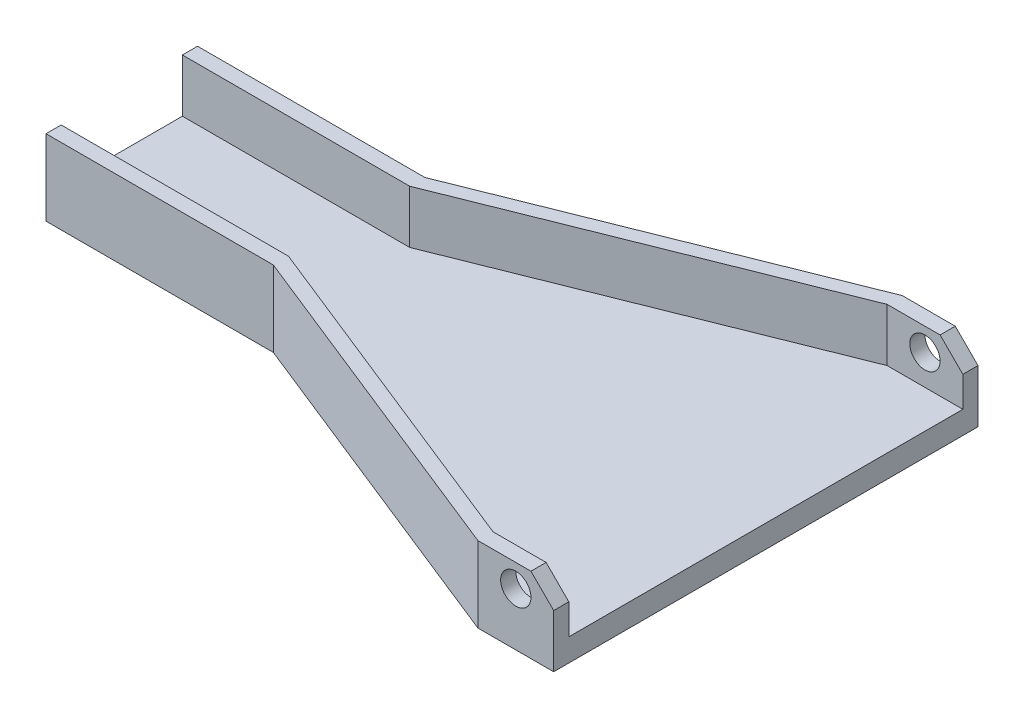
ISO-10303-21;
HEADER;
FILE_DESCRIPTION(('STEP AP214'),'2;1');
FILE_NAME('part.step','',(''),(''),'','','');
FILE_SCHEMA(('AUTOMOTIVE_DESIGN { 1 0 10303 214 1 1 1 1 }'));
ENDSEC;
DATA;
#1=APPLICATION_CONTEXT('core data for automotive mechanical design processes');
#2=APPLICATION_PROTOCOL_DEFINITION('international standard','automotive_design',2000,#1);
#3=PRODUCT_CONTEXT('',#1,'mechanical');
#4=PRODUCT('Part','Part','',(#3));
#5=PRODUCT_RELATED_PRODUCT_CATEGORY('part','',(#4));
#6=PRODUCT_DEFINITION_FORMATION('','',#4);
#7=PRODUCT_DEFINITION_CONTEXT('part definition',#1,'design');
#8=PRODUCT_DEFINITION('design','',#6,#7);
#9=PRODUCT_DEFINITION_SHAPE('','',#8);
#10=(LENGTH_UNIT() NAMED_UNIT(*) SI_UNIT(.MILLI.,.METRE.));
#11=(NAMED_UNIT(*) PLANE_ANGLE_UNIT() SI_UNIT($,.RADIAN.));
#12=(NAMED_UNIT(*) SI_UNIT($,.STERADIAN.) SOLID_ANGLE_UNIT());
#13=UNCERTAINTY_MEASURE_WITH_UNIT(LENGTH_MEASURE(1.E-05),#10,'distance_accuracy_value','');
#14=(GEOMETRIC_REPRESENTATION_CONTEXT(3) GLOBAL_UNCERTAINTY_ASSIGNED_CONTEXT((#13)) GLOBAL_UNIT_ASSIGNED_CONTEXT((#10,
#11,#12)) REPRESENTATION_CONTEXT('',''));
#15=CARTESIAN_POINT('',(0.,0.,0.));
#16=DIRECTION('',(0.,0.,1.));
#17=DIRECTION('',(1.,0.,0.));
#18=AXIS2_PLACEMENT_3D('',#15,#16,#17);
#19=CARTESIAN_POINT('',(0.,3.,0.));
#20=DIRECTION('',(0.,1.,0.));
#21=DIRECTION('',(0.,0.,1.));
#22=AXIS2_PLACEMENT_3D('',#19,#20,#21);
#23=PLANE('',#22);
#24=DIRECTION('',(-0.928476690885259,0.,-0.371390676354104));
#25=VECTOR('',#24,1.);
#26=CARTESIAN_POINT('',(15.,3.,8.));
#27=LINE('',#26,#25);
#28=CARTESIAN_POINT('',(60.,3.,26.));
#29=VERTEX_POINT('',#28);
#30=CARTESIAN_POINT('',(15.,3.,8.));
#31=VERTEX_POINT('',#30);
#32=EDGE_CURVE('E185',#29,#31,#27,.T.);
#33=ORIENTED_EDGE('',*,*,#32,.F.);
#34=DIRECTION('',(-1.,0.,0.));
#35=VECTOR('',#34,1.);
#36=CARTESIAN_POINT('',(60.,3.,26.));
#37=LINE('',#36,#35);
#38=CARTESIAN_POINT('',(70.,3.,26.));
#39=VERTEX_POINT('',#38);
#40=EDGE_CURVE('E358',#39,#29,#37,.T.);
#41=ORIENTED_EDGE('',*,*,#40,.F.);
#42=DIRECTION('',(0.,0.,-1.));
#43=VECTOR('',#42,1.);
#44=CARTESIAN_POINT('',(70.,3.,28.));
#45=LINE('',#44,#43);
#46=CARTESIAN_POINT('',(70.,3.,-26.));
#47=VERTEX_POINT('',#46);
#48=EDGE_CURVE('E201',#39,#47,#45,.T.);
#49=ORIENTED_EDGE('',*,*,#48,.T.);
#50=DIRECTION('',(1.,0.,0.));
#51=VECTOR('',#50,1.);
#52=CARTESIAN_POINT('',(70.,3.,-26.));
#53=LINE('',#52,#51);
#54=CARTESIAN_POINT('',(60.,3.,-26.));
#55=VERTEX_POINT('',#54);
#56=EDGE_CURVE('E333',#55,#47,#53,.T.);
#57=ORIENTED_EDGE('',*,*,#56,.F.);
#58=DIRECTION('',(0.928476690885259,0.,-0.371390676354104));
#59=VECTOR('',#58,1.);
#60=CARTESIAN_POINT('',(60.,3.,-26.));
#61=LINE('',#60,#59);
#62=CARTESIAN_POINT('',(15.,3.,-8.00000000000001));
#63=VERTEX_POINT('',#62);
#64=EDGE_CURVE('E357',#63,#55,#61,.T.);
#65=ORIENTED_EDGE('',*,*,#64,.F.);
#66=DIRECTION('',(1.,0.,0.));
#67=VECTOR('',#66,1.);
#68=CARTESIAN_POINT('',(15.,3.,-8.00000000000001));
#69=LINE('',#68,#67);
#70=CARTESIAN_POINT('',(-15.,3.,-8.));
#71=VERTEX_POINT('',#70);
#72=EDGE_CURVE('E199',#71,#63,#69,.T.);
#73=ORIENTED_EDGE('',*,*,#72,.F.);
#74=DIRECTION('',(0.,0.,1.));
#75=VECTOR('',#74,1.);
#76=CARTESIAN_POINT('',(-15.,3.,10.));
#77=LINE('',#76,#75);
#78=CARTESIAN_POINT('',(-15.,3.,8.));
#79=VERTEX_POINT('',#78);
#80=EDGE_CURVE('E192',#71,#79,#77,.T.);
#81=ORIENTED_EDGE('',*,*,#80,.T.);
#82=DIRECTION('',(-1.,0.,0.));
#83=VECTOR('',#82,1.);
#84=CARTESIAN_POINT('',(-15.,3.,8.));
#85=LINE('',#84,#83);
#86=EDGE_CURVE('E172',#31,#79,#85,.T.);
#87=ORIENTED_EDGE('',*,*,#86,.F.);
#88=EDGE_LOOP('',(#33,#41,#49,#57,#65,#73,#81,#87));
#89=FACE_BOUND('',#88,.T.);
#90=ADVANCED_FACE('F45',(#89),#23,.T.);
#91=CARTESIAN_POINT('',(15.,3.,-10.));
#92=DIRECTION('',(0.371390676354104,0.,0.928476690885259));
#93=DIRECTION('',(0.928476690885259,0.,-0.371390676354104));
#94=AXIS2_PLACEMENT_3D('',#91,#92,#93);
#95=PLANE('',#94);
#96=DIRECTION('',(-0.928476690885259,0.,0.371390676354104));
#97=VECTOR('',#96,1.);
#98=CARTESIAN_POINT('',(15.,0.,-10.));
#99=LINE('',#98,#97);
#100=CARTESIAN_POINT('',(60.,0.,-28.));
#101=VERTEX_POINT('',#100);
#102=CARTESIAN_POINT('',(15.,0.,-10.));
#103=VERTEX_POINT('',#102);
#104=EDGE_CURVE('E215',#101,#103,#99,.T.);
#105=ORIENTED_EDGE('',*,*,#104,.T.);
#106=DIRECTION('',(0.,-1.,0.));
#107=VECTOR('',#106,1.);
#108=CARTESIAN_POINT('',(15.,3.,-10.));
#109=LINE('',#108,#107);
#110=CARTESIAN_POINT('',(15.,10.,-10.));
#111=VERTEX_POINT('',#110);
#112=EDGE_CURVE('E263',#111,#103,#109,.T.);
#113=ORIENTED_EDGE('',*,*,#112,.F.);
#114=DIRECTION('',(-0.928476690885259,0.,0.371390676354104));
#115=VECTOR('',#114,1.);
#116=CARTESIAN_POINT('',(15.,10.,-10.));
#117=LINE('',#116,#115);
#118=CARTESIAN_POINT('',(60.,10.,-28.));
#119=VERTEX_POINT('',#118);
#120=EDGE_CURVE('E346',#119,#111,#117,.T.);
#121=ORIENTED_EDGE('',*,*,#120,.F.);
#122=DIRECTION('',(0.,-1.,0.));
#123=VECTOR('',#122,1.);
#124=CARTESIAN_POINT('',(60.,3.,-28.));
#125=LINE('',#124,#123);
#126=EDGE_CURVE('E207',#119,#101,#125,.T.);
#127=ORIENTED_EDGE('',*,*,#126,.T.);
#128=EDGE_LOOP('',(#105,#113,#121,#127));
#129=FACE_BOUND('',#128,.T.);
#130=ADVANCED_FACE('F446',(#129),#95,.F.);
#131=CARTESIAN_POINT('',(-15.,3.,-10.));
#132=DIRECTION('',(0.,0.,1.));
#133=DIRECTION('',(1.,0.,0.));
#134=AXIS2_PLACEMENT_3D('',#131,#132,#133);
#135=PLANE('',#134);
#136=DIRECTION('',(-1.,0.,0.));
#137=VECTOR('',#136,1.);
#138=CARTESIAN_POINT('',(-15.,0.,-10.));
#139=LINE('',#138,#137);
#140=CARTESIAN_POINT('',(-15.,0.,-10.));
#141=VERTEX_POINT('',#140);
#142=EDGE_CURVE('E219',#103,#141,#139,.T.);
#143=ORIENTED_EDGE('',*,*,#142,.T.);
#144=DIRECTION('',(0.,-1.,0.));
#145=VECTOR('',#144,1.);
#146=CARTESIAN_POINT('',(-15.,3.,-10.));
#147=LINE('',#146,#145);
#148=CARTESIAN_POINT('',(-15.,10.,-10.));
#149=VERTEX_POINT('',#148);
#150=EDGE_CURVE('E259',#149,#141,#147,.T.);
#151=ORIENTED_EDGE('',*,*,#150,.F.);
#152=DIRECTION('',(-1.,0.,0.));
#153=VECTOR('',#152,1.);
#154=CARTESIAN_POINT('',(-15.,10.,-10.));
#155=LINE('',#154,#153);
#156=EDGE_CURVE('E350',#111,#149,#155,.T.);
#157=ORIENTED_EDGE('',*,*,#156,.F.);
#158=ORIENTED_EDGE('',*,*,#112,.T.);
#159=EDGE_LOOP('',(#143,#151,#157,#158));
#160=FACE_BOUND('',#159,.T.);
#161=ADVANCED_FACE('F386',(#160),#135,.F.);
#162=CARTESIAN_POINT('',(-15.,3.,10.));
#163=DIRECTION('',(1.,0.,0.));
#164=DIRECTION('',(0.,0.,-1.));
#165=AXIS2_PLACEMENT_3D('',#162,#163,#164);
#166=PLANE('',#165);
#167=DIRECTION('',(0.,0.,1.));
#168=VECTOR('',#167,1.);
#169=CARTESIAN_POINT('',(-15.,0.,10.));
#170=LINE('',#169,#168);
#171=CARTESIAN_POINT('',(-15.,0.,10.));
#172=VERTEX_POINT('',#171);
#173=EDGE_CURVE('E222',#141,#172,#170,.T.);
#174=ORIENTED_EDGE('',*,*,#173,.T.);
#175=DIRECTION('',(0.,-1.,0.));
#176=VECTOR('',#175,1.);
#177=CARTESIAN_POINT('',(-15.,3.,10.));
#178=LINE('',#177,#176);
#179=CARTESIAN_POINT('',(-15.,10.,10.));
#180=VERTEX_POINT('',#179);
#181=EDGE_CURVE('E255',#180,#172,#178,.T.);
#182=ORIENTED_EDGE('',*,*,#181,.F.);
#183=DIRECTION('',(0.,0.,1.));
#184=VECTOR('',#183,1.);
#185=CARTESIAN_POINT('',(-15.,10.,10.));
#186=LINE('',#185,#184);
#187=CARTESIAN_POINT('',(-15.,10.,8.));
#188=VERTEX_POINT('',#187);
#189=EDGE_CURVE('E186',#188,#180,#186,.T.);
#190=ORIENTED_EDGE('',*,*,#189,.F.);
#191=DIRECTION('',(0.,-1.,0.));
#192=VECTOR('',#191,1.);
#193=CARTESIAN_POINT('',(-15.,10.,8.));
#194=LINE('',#193,#192);
#195=EDGE_CURVE('E176',#188,#79,#194,.T.);
#196=ORIENTED_EDGE('',*,*,#195,.T.);
#197=ORIENTED_EDGE('',*,*,#80,.F.);
#198=DIRECTION('',(0.,-1.,0.));
#199=VECTOR('',#198,1.);
#200=CARTESIAN_POINT('',(-15.,10.,-7.99999999999999));
#201=LINE('',#200,#199);
#202=CARTESIAN_POINT('',(-15.,10.,-7.99999999999999));
#203=VERTEX_POINT('',#202);
#204=EDGE_CURVE('E212',#203,#71,#201,.T.);
#205=ORIENTED_EDGE('',*,*,#204,.F.);
#206=DIRECTION('',(0.,0.,1.));
#207=VECTOR('',#206,1.);
#208=CARTESIAN_POINT('',(-15.,10.,-7.99999999999999));
#209=LINE('',#208,#207);
#210=EDGE_CURVE('E328',#149,#203,#209,.T.);
#211=ORIENTED_EDGE('',*,*,#210,.F.);
#212=ORIENTED_EDGE('',*,*,#150,.T.);
#213=EDGE_LOOP('',(#174,#182,#190,#196,#197,#205,#211,#212));
#214=FACE_BOUND('',#213,.T.);
#215=ADVANCED_FACE('F190',(#214),#166,.F.);
#216=CARTESIAN_POINT('',(-15.,3.,10.));
#217=DIRECTION('',(0.,0.,-1.));
#218=DIRECTION('',(-1.,0.,0.));
#219=AXIS2_PLACEMENT_3D('',#216,#217,#218);
#220=PLANE('',#219);
#221=DIRECTION('',(1.,0.,0.));
#222=VECTOR('',#221,1.);
#223=CARTESIAN_POINT('',(-15.,0.,10.));
#224=LINE('',#223,#222);
#225=CARTESIAN_POINT('',(15.,0.,10.));
#226=VERTEX_POINT('',#225);
#227=EDGE_CURVE('E225',#172,#226,#224,.T.);
#228=ORIENTED_EDGE('',*,*,#227,.T.);
#229=DIRECTION('',(0.,-1.,0.));
#230=VECTOR('',#229,1.);
#231=CARTESIAN_POINT('',(15.,3.,10.));
#232=LINE('',#231,#230);
#233=CARTESIAN_POINT('',(15.,10.,10.));
#234=VERTEX_POINT('',#233);
#235=EDGE_CURVE('E251',#234,#226,#232,.T.);
#236=ORIENTED_EDGE('',*,*,#235,.F.);
#237=DIRECTION('',(1.,0.,0.));
#238=VECTOR('',#237,1.);
#239=CARTESIAN_POINT('',(-15.,10.,10.));
#240=LINE('',#239,#238);
#241=EDGE_CURVE('E318',#180,#234,#240,.T.);
#242=ORIENTED_EDGE('',*,*,#241,.F.);
#243=ORIENTED_EDGE('',*,*,#181,.T.);
#244=EDGE_LOOP('',(#228,#236,#242,#243));
#245=FACE_BOUND('',#244,.T.);
#246=ADVANCED_FACE('F395',(#245),#220,.F.);
#247=CARTESIAN_POINT('',(15.,3.,10.));
#248=DIRECTION('',(0.371390676354104,0.,-0.928476690885259));
#249=DIRECTION('',(-0.928476690885259,0.,-0.371390676354104));
#250=AXIS2_PLACEMENT_3D('',#247,#248,#249);
#251=PLANE('',#250);
#252=DIRECTION('',(0.928476690885259,0.,0.371390676354104));
#253=VECTOR('',#252,1.);
#254=CARTESIAN_POINT('',(15.,0.,10.));
#255=LINE('',#254,#253);
#256=CARTESIAN_POINT('',(60.,0.,28.));
#257=VERTEX_POINT('',#256);
#258=EDGE_CURVE('E228',#226,#257,#255,.T.);
#259=ORIENTED_EDGE('',*,*,#258,.T.);
#260=DIRECTION('',(0.,-1.,0.));
#261=VECTOR('',#260,1.);
#262=CARTESIAN_POINT('',(60.,3.,28.));
#263=LINE('',#262,#261);
#264=CARTESIAN_POINT('',(60.,10.,28.));
#265=VERTEX_POINT('',#264);
#266=EDGE_CURVE('E247',#265,#257,#263,.T.);
#267=ORIENTED_EDGE('',*,*,#266,.F.);
#268=DIRECTION('',(0.928476690885259,0.,0.371390676354104));
#269=VECTOR('',#268,1.);
#270=CARTESIAN_POINT('',(15.,10.,10.));
#271=LINE('',#270,#269);
#272=EDGE_CURVE('E313',#234,#265,#271,.T.);
#273=ORIENTED_EDGE('',*,*,#272,.F.);
#274=ORIENTED_EDGE('',*,*,#235,.T.);
#275=EDGE_LOOP('',(#259,#267,#273,#274));
#276=FACE_BOUND('',#275,.T.);
#277=ADVANCED_FACE('F546',(#276),#251,.F.);
#278=CARTESIAN_POINT('',(60.,3.,28.));
#279=DIRECTION('',(0.,0.,-1.));
#280=DIRECTION('',(-1.,0.,0.));
#281=AXIS2_PLACEMENT_3D('',#278,#279,#280);
#282=PLANE('',#281);
#283=CARTESIAN_POINT('',(65.,7.,28.));
#284=DIRECTION('',(0.,0.,1.));
#285=DIRECTION('',(1.,0.,0.));
#286=AXIS2_PLACEMENT_3D('',#283,#284,#285);
#287=CIRCLE('',#286,2.);
#288=CARTESIAN_POINT('',(67.,7.,28.));
#289=VERTEX_POINT('',#288);
#290=EDGE_CURVE('E413',#289,#289,#287,.T.);
#291=ORIENTED_EDGE('',*,*,#290,.F.);
#292=EDGE_LOOP('',(#291));
#293=FACE_BOUND('',#292,.T.);
#294=DIRECTION('',(0.,-1.,0.));
#295=VECTOR('',#294,1.);
#296=CARTESIAN_POINT('',(70.,3.,28.));
#297=LINE('',#296,#295);
#298=CARTESIAN_POINT('',(70.,6.99999999999998,28.));
#299=VERTEX_POINT('',#298);
#300=CARTESIAN_POINT('',(70.,0.,28.));
#301=VERTEX_POINT('',#300);
#302=EDGE_CURVE('E244',#299,#301,#297,.T.);
#303=ORIENTED_EDGE('',*,*,#302,.F.);
#304=DIRECTION('',(0.707106781186546,-0.707106781186549,0.));
#305=VECTOR('',#304,1.);
#306=CARTESIAN_POINT('',(67.,10.,28.));
#307=LINE('',#306,#305);
#308=CARTESIAN_POINT('',(67.,10.,28.));
#309=VERTEX_POINT('',#308);
#310=EDGE_CURVE('E11',#299,#309,#307,.F.);
#311=ORIENTED_EDGE('',*,*,#310,.T.);
#312=DIRECTION('',(1.,0.,0.));
#313=VECTOR('',#312,1.);
#314=CARTESIAN_POINT('',(60.,10.,28.));
#315=LINE('',#314,#313);
#316=EDGE_CURVE('E310',#265,#309,#315,.T.);
#317=ORIENTED_EDGE('',*,*,#316,.F.);
#318=ORIENTED_EDGE('',*,*,#266,.T.);
#319=DIRECTION('',(1.,0.,0.));
#320=VECTOR('',#319,1.);
#321=CARTESIAN_POINT('',(60.,0.,28.));
#322=LINE('',#321,#320);
#323=EDGE_CURVE('E231',#257,#301,#322,.T.);
#324=ORIENTED_EDGE('',*,*,#323,.T.);
#325=EDGE_LOOP('',(#303,#311,#317,#318,#324));
#326=FACE_BOUND('',#325,.T.);
#327=ADVANCED_FACE('F536',(#293,#326),#282,.F.);
#328=CARTESIAN_POINT('',(70.,3.,28.));
#329=DIRECTION('',(-1.,0.,0.));
#330=DIRECTION('',(0.,0.,1.));
#331=AXIS2_PLACEMENT_3D('',#328,#329,#330);
#332=PLANE('',#331);
#333=DIRECTION('',(0.,-1.,0.));
#334=VECTOR('',#333,1.);
#335=CARTESIAN_POINT('',(70.,3.,-28.));
#336=LINE('',#335,#334);
#337=CARTESIAN_POINT('',(70.,6.99999999999998,-28.));
#338=VERTEX_POINT('',#337);
#339=CARTESIAN_POINT('',(70.,0.,-28.));
#340=VERTEX_POINT('',#339);
#341=EDGE_CURVE('E241',#338,#340,#336,.T.);
#342=ORIENTED_EDGE('',*,*,#341,.F.);
#343=DIRECTION('',(0.,0.,1.));
#344=VECTOR('',#343,1.);
#345=CARTESIAN_POINT('',(70.,6.99999999999998,28.));
#346=LINE('',#345,#344);
#347=CARTESIAN_POINT('',(70.,6.99999999999998,-26.));
#348=VERTEX_POINT('',#347);
#349=EDGE_CURVE('E283',#338,#348,#346,.T.);
#350=ORIENTED_EDGE('',*,*,#349,.T.);
#351=DIRECTION('',(0.,-1.,0.));
#352=VECTOR('',#351,1.);
#353=CARTESIAN_POINT('',(70.,10.,-26.));
#354=LINE('',#353,#352);
#355=EDGE_CURVE('E354',#348,#47,#354,.T.);
#356=ORIENTED_EDGE('',*,*,#355,.T.);
#357=ORIENTED_EDGE('',*,*,#48,.F.);
#358=DIRECTION('',(0.,-1.,0.));
#359=VECTOR('',#358,1.);
#360=CARTESIAN_POINT('',(70.,10.,26.));
#361=LINE('',#360,#359);
#362=CARTESIAN_POINT('',(70.,6.99999999999998,26.));
#363=VERTEX_POINT('',#362);
#364=EDGE_CURVE('E296',#363,#39,#361,.T.);
#365=ORIENTED_EDGE('',*,*,#364,.F.);
#366=DIRECTION('',(0.,0.,1.));
#367=VECTOR('',#366,1.);
#368=CARTESIAN_POINT('',(70.,6.99999999999998,28.));
#369=LINE('',#368,#367);
#370=EDGE_CURVE('E280',#363,#299,#369,.T.);
#371=ORIENTED_EDGE('',*,*,#370,.T.);
#372=ORIENTED_EDGE('',*,*,#302,.T.);
#373=DIRECTION('',(0.,0.,-1.));
#374=VECTOR('',#373,1.);
#375=CARTESIAN_POINT('',(70.,0.,28.));
#376=LINE('',#375,#374);
#377=EDGE_CURVE('E209',#301,#340,#376,.T.);
#378=ORIENTED_EDGE('',*,*,#377,.T.);
#379=EDGE_LOOP('',(#342,#350,#356,#357,#365,#371,#372,#378));
#380=FACE_BOUND('',#379,.T.);
#381=ADVANCED_FACE('F303',(#380),#332,.F.);
#382=CARTESIAN_POINT('',(60.,3.,-28.));
#383=DIRECTION('',(0.,0.,1.));
#384=DIRECTION('',(1.,0.,0.));
#385=AXIS2_PLACEMENT_3D('',#382,#383,#384);
#386=PLANE('',#385);
#387=CARTESIAN_POINT('',(65.,7.,-28.));
#388=DIRECTION('',(0.,0.,1.));
#389=DIRECTION('',(1.,0.,0.));
#390=AXIS2_PLACEMENT_3D('',#387,#388,#389);
#391=CIRCLE('',#390,2.);
#392=CARTESIAN_POINT('',(67.,7.,-28.));
#393=VERTEX_POINT('',#392);
#394=EDGE_CURVE('E273',#393,#393,#391,.T.);
#395=ORIENTED_EDGE('',*,*,#394,.T.);
#396=EDGE_LOOP('',(#395));
#397=FACE_BOUND('',#396,.T.);
#398=DIRECTION('',(-1.,0.,0.));
#399=VECTOR('',#398,1.);
#400=CARTESIAN_POINT('',(60.,10.,-28.));
#401=LINE('',#400,#399);
#402=CARTESIAN_POINT('',(67.,10.,-28.));
#403=VERTEX_POINT('',#402);
#404=EDGE_CURVE('E343',#403,#119,#401,.T.);
#405=ORIENTED_EDGE('',*,*,#404,.F.);
#406=DIRECTION('',(-0.707106781186546,0.707106781186549,0.));
#407=VECTOR('',#406,1.);
#408=CARTESIAN_POINT('',(67.,10.,-28.));
#409=LINE('',#408,#407);
#410=EDGE_CURVE('E277',#403,#338,#409,.F.);
#411=ORIENTED_EDGE('',*,*,#410,.T.);
#412=ORIENTED_EDGE('',*,*,#341,.T.);
#413=DIRECTION('',(-1.,0.,0.));
#414=VECTOR('',#413,1.);
#415=CARTESIAN_POINT('',(60.,0.,-28.));
#416=LINE('',#415,#414);
#417=EDGE_CURVE('E202',#340,#101,#416,.T.);
#418=ORIENTED_EDGE('',*,*,#417,.T.);
#419=ORIENTED_EDGE('',*,*,#126,.F.);
#420=EDGE_LOOP('',(#405,#411,#412,#418,#419));
#421=FACE_BOUND('',#420,.T.);
#422=ADVANCED_FACE('F421',(#397,#421),#386,.F.);
#423=CARTESIAN_POINT('',(0.,0.,0.));
#424=DIRECTION('',(0.,1.,0.));
#425=DIRECTION('',(0.,0.,1.));
#426=AXIS2_PLACEMENT_3D('',#423,#424,#425);
#427=PLANE('',#426);
#428=ORIENTED_EDGE('',*,*,#104,.F.);
#429=ORIENTED_EDGE('',*,*,#417,.F.);
#430=ORIENTED_EDGE('',*,*,#377,.F.);
#431=ORIENTED_EDGE('',*,*,#323,.F.);
#432=ORIENTED_EDGE('',*,*,#258,.F.);
#433=ORIENTED_EDGE('',*,*,#227,.F.);
#434=ORIENTED_EDGE('',*,*,#173,.F.);
#435=ORIENTED_EDGE('',*,*,#142,.F.);
#436=EDGE_LOOP('',(#428,#429,#430,#431,#432,#433,#434,#435));
#437=FACE_BOUND('',#436,.T.);
#438=ADVANCED_FACE('F389',(#437),#427,.F.);
#439=CARTESIAN_POINT('',(15.,10.,-8.00000000000001));
#440=DIRECTION('',(0.,0.,-1.));
#441=DIRECTION('',(-1.,0.,0.));
#442=AXIS2_PLACEMENT_3D('',#439,#440,#441);
#443=PLANE('',#442);
#444=ORIENTED_EDGE('',*,*,#72,.T.);
#445=DIRECTION('',(0.,-1.,0.));
#446=VECTOR('',#445,1.);
#447=CARTESIAN_POINT('',(15.,10.,-8.00000000000001));
#448=LINE('',#447,#446);
#449=CARTESIAN_POINT('',(15.,10.,-8.00000000000001));
#450=VERTEX_POINT('',#449);
#451=EDGE_CURVE('E370',#450,#63,#448,.T.);
#452=ORIENTED_EDGE('',*,*,#451,.F.);
#453=DIRECTION('',(1.,0.,0.));
#454=VECTOR('',#453,1.);
#455=CARTESIAN_POINT('',(15.,10.,-8.00000000000001));
#456=LINE('',#455,#454);
#457=EDGE_CURVE('E332',#203,#450,#456,.T.);
#458=ORIENTED_EDGE('',*,*,#457,.F.);
#459=ORIENTED_EDGE('',*,*,#204,.T.);
#460=EDGE_LOOP('',(#444,#452,#458,#459));
#461=FACE_BOUND('',#460,.T.);
#462=ADVANCED_FACE('F378',(#461),#443,.F.);
#463=CARTESIAN_POINT('',(60.,10.,-26.));
#464=DIRECTION('',(-0.371390676354104,0.,-0.928476690885259));
#465=DIRECTION('',(-0.928476690885259,0.,0.371390676354104));
#466=AXIS2_PLACEMENT_3D('',#463,#464,#465);
#467=PLANE('',#466);
#468=ORIENTED_EDGE('',*,*,#64,.T.);
#469=DIRECTION('',(0.,-1.,0.));
#470=VECTOR('',#469,1.);
#471=CARTESIAN_POINT('',(60.,10.,-26.));
#472=LINE('',#471,#470);
#473=CARTESIAN_POINT('',(60.,10.,-26.));
#474=VERTEX_POINT('',#473);
#475=EDGE_CURVE('E367',#474,#55,#472,.T.);
#476=ORIENTED_EDGE('',*,*,#475,.F.);
#477=DIRECTION('',(0.928476690885259,0.,-0.371390676354104));
#478=VECTOR('',#477,1.);
#479=CARTESIAN_POINT('',(60.,10.,-26.));
#480=LINE('',#479,#478);
#481=EDGE_CURVE('E336',#450,#474,#480,.T.);
#482=ORIENTED_EDGE('',*,*,#481,.F.);
#483=ORIENTED_EDGE('',*,*,#451,.T.);
#484=EDGE_LOOP('',(#468,#476,#482,#483));
#485=FACE_BOUND('',#484,.T.);
#486=ADVANCED_FACE('F435',(#485),#467,.F.);
#487=CARTESIAN_POINT('',(70.,10.,-26.));
#488=DIRECTION('',(0.,0.,-1.));
#489=DIRECTION('',(-1.,0.,0.));
#490=AXIS2_PLACEMENT_3D('',#487,#488,#489);
#491=PLANE('',#490);
#492=CARTESIAN_POINT('',(65.,7.,-26.));
#493=DIRECTION('',(0.,0.,-1.));
#494=DIRECTION('',(-1.,0.,0.));
#495=AXIS2_PLACEMENT_3D('',#492,#493,#494);
#496=CIRCLE('',#495,2.);
#497=CARTESIAN_POINT('',(63.,7.,-26.));
#498=VERTEX_POINT('',#497);
#499=EDGE_CURVE('E272',#498,#498,#496,.T.);
#500=ORIENTED_EDGE('',*,*,#499,.T.);
#501=EDGE_LOOP('',(#500));
#502=FACE_BOUND('',#501,.T.);
#503=ORIENTED_EDGE('',*,*,#355,.F.);
#504=DIRECTION('',(0.707106781186546,-0.707106781186549,0.));
#505=VECTOR('',#504,1.);
#506=CARTESIAN_POINT('',(67.,10.,-26.));
#507=LINE('',#506,#505);
#508=CARTESIAN_POINT('',(67.,10.,-26.));
#509=VERTEX_POINT('',#508);
#510=EDGE_CURVE('E286',#348,#509,#507,.F.);
#511=ORIENTED_EDGE('',*,*,#510,.T.);
#512=DIRECTION('',(1.,0.,0.));
#513=VECTOR('',#512,1.);
#514=CARTESIAN_POINT('',(70.,10.,-26.));
#515=LINE('',#514,#513);
#516=EDGE_CURVE('E339',#474,#509,#515,.T.);
#517=ORIENTED_EDGE('',*,*,#516,.F.);
#518=ORIENTED_EDGE('',*,*,#475,.T.);
#519=ORIENTED_EDGE('',*,*,#56,.T.);
#520=EDGE_LOOP('',(#503,#511,#517,#518,#519));
#521=FACE_BOUND('',#520,.T.);
#522=ADVANCED_FACE('F432',(#502,#521),#491,.F.);
#523=CARTESIAN_POINT('',(0.,10.,0.));
#524=DIRECTION('',(0.,-1.,0.));
#525=DIRECTION('',(0.,0.,-1.));
#526=AXIS2_PLACEMENT_3D('',#523,#524,#525);
#527=PLANE('',#526);
#528=ORIENTED_EDGE('',*,*,#516,.T.);
#529=DIRECTION('',(0.,0.,-1.));
#530=VECTOR('',#529,1.);
#531=CARTESIAN_POINT('',(67.,10.,0.));
#532=LINE('',#531,#530);
#533=EDGE_CURVE('E267',#509,#403,#532,.T.);
#534=ORIENTED_EDGE('',*,*,#533,.T.);
#535=ORIENTED_EDGE('',*,*,#404,.T.);
#536=ORIENTED_EDGE('',*,*,#120,.T.);
#537=ORIENTED_EDGE('',*,*,#156,.T.);
#538=ORIENTED_EDGE('',*,*,#210,.T.);
#539=ORIENTED_EDGE('',*,*,#457,.T.);
#540=ORIENTED_EDGE('',*,*,#481,.T.);
#541=EDGE_LOOP('',(#528,#534,#535,#536,#537,#538,#539,#540));
#542=FACE_BOUND('',#541,.T.);
#543=ADVANCED_FACE('F382',(#542),#527,.F.);
#544=CARTESIAN_POINT('',(60.,10.,26.));
#545=DIRECTION('',(0.,0.,1.));
#546=DIRECTION('',(1.,0.,0.));
#547=AXIS2_PLACEMENT_3D('',#544,#545,#546);
#548=PLANE('',#547);
#549=CARTESIAN_POINT('',(65.,7.,26.));
#550=DIRECTION('',(0.,0.,1.));
#551=DIRECTION('',(1.,0.,0.));
#552=AXIS2_PLACEMENT_3D('',#549,#550,#551);
#553=CIRCLE('',#552,2.);
#554=CARTESIAN_POINT('',(67.,7.,26.));
#555=VERTEX_POINT('',#554);
#556=EDGE_CURVE('E268',#555,#555,#553,.T.);
#557=ORIENTED_EDGE('',*,*,#556,.T.);
#558=EDGE_LOOP('',(#557));
#559=FACE_BOUND('',#558,.T.);
#560=DIRECTION('',(-1.,0.,0.));
#561=VECTOR('',#560,1.);
#562=CARTESIAN_POINT('',(60.,10.,26.));
#563=LINE('',#562,#561);
#564=CARTESIAN_POINT('',(67.,10.,26.));
#565=VERTEX_POINT('',#564);
#566=CARTESIAN_POINT('',(60.,10.,26.));
#567=VERTEX_POINT('',#566);
#568=EDGE_CURVE('E299',#565,#567,#563,.T.);
#569=ORIENTED_EDGE('',*,*,#568,.F.);
#570=DIRECTION('',(-0.707106781186546,0.707106781186549,0.));
#571=VECTOR('',#570,1.);
#572=CARTESIAN_POINT('',(67.,10.,26.));
#573=LINE('',#572,#571);
#574=EDGE_CURVE('E55',#565,#363,#573,.F.);
#575=ORIENTED_EDGE('',*,*,#574,.T.);
#576=ORIENTED_EDGE('',*,*,#364,.T.);
#577=ORIENTED_EDGE('',*,*,#40,.T.);
#578=DIRECTION('',(0.,-1.,0.));
#579=VECTOR('',#578,1.);
#580=CARTESIAN_POINT('',(60.,10.,26.));
#581=LINE('',#580,#579);
#582=EDGE_CURVE('E305',#567,#29,#581,.T.);
#583=ORIENTED_EDGE('',*,*,#582,.F.);
#584=EDGE_LOOP('',(#569,#575,#576,#577,#583));
#585=FACE_BOUND('',#584,.T.);
#586=ADVANCED_FACE('F295',(#559,#585),#548,.F.);
#587=CARTESIAN_POINT('',(15.,10.,8.));
#588=DIRECTION('',(-0.371390676354104,0.,0.928476690885259));
#589=DIRECTION('',(0.928476690885259,0.,0.371390676354104));
#590=AXIS2_PLACEMENT_3D('',#587,#588,#589);
#591=PLANE('',#590);
#592=ORIENTED_EDGE('',*,*,#32,.T.);
#593=DIRECTION('',(0.,-1.,0.));
#594=VECTOR('',#593,1.);
#595=CARTESIAN_POINT('',(15.,10.,8.));
#596=LINE('',#595,#594);
#597=CARTESIAN_POINT('',(15.,10.,8.));
#598=VERTEX_POINT('',#597);
#599=EDGE_CURVE('E179',#598,#31,#596,.T.);
#600=ORIENTED_EDGE('',*,*,#599,.F.);
#601=DIRECTION('',(-0.928476690885259,0.,-0.371390676354104));
#602=VECTOR('',#601,1.);
#603=CARTESIAN_POINT('',(15.,10.,8.));
#604=LINE('',#603,#602);
#605=EDGE_CURVE('E320',#567,#598,#604,.T.);
#606=ORIENTED_EDGE('',*,*,#605,.F.);
#607=ORIENTED_EDGE('',*,*,#582,.T.);
#608=EDGE_LOOP('',(#592,#600,#606,#607));
#609=FACE_BOUND('',#608,.T.);
#610=ADVANCED_FACE('F494',(#609),#591,.F.);
#611=CARTESIAN_POINT('',(-15.,10.,8.));
#612=DIRECTION('',(0.,0.,1.));
#613=DIRECTION('',(1.,0.,0.));
#614=AXIS2_PLACEMENT_3D('',#611,#612,#613);
#615=PLANE('',#614);
#616=ORIENTED_EDGE('',*,*,#86,.T.);
#617=ORIENTED_EDGE('',*,*,#195,.F.);
#618=DIRECTION('',(-1.,0.,0.));
#619=VECTOR('',#618,1.);
#620=CARTESIAN_POINT('',(-15.,10.,8.));
#621=LINE('',#620,#619);
#622=EDGE_CURVE('E196',#598,#188,#621,.T.);
#623=ORIENTED_EDGE('',*,*,#622,.F.);
#624=ORIENTED_EDGE('',*,*,#599,.T.);
#625=EDGE_LOOP('',(#616,#617,#623,#624));
#626=FACE_BOUND('',#625,.T.);
#627=ADVANCED_FACE('F174',(#626),#615,.F.);
#628=CARTESIAN_POINT('',(0.,10.,0.));
#629=DIRECTION('',(0.,-1.,0.));
#630=DIRECTION('',(0.,0.,-1.));
#631=AXIS2_PLACEMENT_3D('',#628,#629,#630);
#632=PLANE('',#631);
#633=ORIENTED_EDGE('',*,*,#316,.T.);
#634=DIRECTION('',(0.,0.,-1.));
#635=VECTOR('',#634,1.);
#636=CARTESIAN_POINT('',(67.,10.,0.));
#637=LINE('',#636,#635);
#638=EDGE_CURVE('E289',#309,#565,#637,.T.);
#639=ORIENTED_EDGE('',*,*,#638,.T.);
#640=ORIENTED_EDGE('',*,*,#568,.T.);
#641=ORIENTED_EDGE('',*,*,#605,.T.);
#642=ORIENTED_EDGE('',*,*,#622,.T.);
#643=ORIENTED_EDGE('',*,*,#189,.T.);
#644=ORIENTED_EDGE('',*,*,#241,.T.);
#645=ORIENTED_EDGE('',*,*,#272,.T.);
#646=EDGE_LOOP('',(#633,#639,#640,#641,#642,#643,#644,#645));
#647=FACE_BOUND('',#646,.T.);
#648=ADVANCED_FACE('F308',(#647),#632,.F.);
#649=CARTESIAN_POINT('',(65.,7.,-28.));
#650=DIRECTION('',(0.,0.,1.));
#651=DIRECTION('',(1.,0.,0.));
#652=AXIS2_PLACEMENT_3D('',#649,#650,#651);
#653=CYLINDRICAL_SURFACE('',#652,2.);
#654=ORIENTED_EDGE('',*,*,#290,.T.);
#655=EDGE_LOOP('',(#654));
#656=FACE_BOUND('',#655,.T.);
#657=ORIENTED_EDGE('',*,*,#556,.F.);
#658=EDGE_LOOP('',(#657));
#659=FACE_BOUND('',#658,.T.);
#660=ADVANCED_FACE('F428',(#656,#659),#653,.F.);
#661=ORIENTED_EDGE('',*,*,#394,.F.);
#662=EDGE_LOOP('',(#661));
#663=FACE_BOUND('',#662,.T.);
#664=ORIENTED_EDGE('',*,*,#499,.F.);
#665=EDGE_LOOP('',(#664));
#666=FACE_BOUND('',#665,.T.);
#667=ADVANCED_FACE('F424',(#663,#666),#653,.F.);
#668=CARTESIAN_POINT('',(67.,10.,0.));
#669=DIRECTION('',(-0.707106781186549,-0.707106781186546,0.));
#670=DIRECTION('',(0.,0.,-1.));
#671=AXIS2_PLACEMENT_3D('',#668,#669,#670);
#672=PLANE('',#671);
#673=ORIENTED_EDGE('',*,*,#510,.F.);
#674=ORIENTED_EDGE('',*,*,#349,.F.);
#675=ORIENTED_EDGE('',*,*,#410,.F.);
#676=ORIENTED_EDGE('',*,*,#533,.F.);
#677=EDGE_LOOP('',(#673,#674,#675,#676));
#678=FACE_BOUND('',#677,.T.);
#679=ADVANCED_FACE('F427',(#678),#672,.F.);
#680=CARTESIAN_POINT('',(67.,10.,0.));
#681=DIRECTION('',(-0.707106781186549,-0.707106781186546,0.));
#682=DIRECTION('',(0.,0.,-1.));
#683=AXIS2_PLACEMENT_3D('',#680,#681,#682);
#684=PLANE('',#683);
#685=ORIENTED_EDGE('',*,*,#310,.F.);
#686=ORIENTED_EDGE('',*,*,#370,.F.);
#687=ORIENTED_EDGE('',*,*,#574,.F.);
#688=ORIENTED_EDGE('',*,*,#638,.F.);
#689=EDGE_LOOP('',(#685,#686,#687,#688));
#690=FACE_BOUND('',#689,.T.);
#691=ADVANCED_FACE('F48',(#690),#684,.F.);
#692=CLOSED_SHELL('',(#90,#130,#161,#215,#246,#277,#327,#381,#422,#438,#462,#486,#522,#543,#586,
#610,#627,#648,#660,#667,#679,#691));
#693=MANIFOLD_SOLID_BREP('B2',#692);
#694=ADVANCED_BREP_SHAPE_REPRESENTATION('',(#18,#693),#14);
#695=SHAPE_DEFINITION_REPRESENTATION(#9,#694);
ENDSEC;
END-ISO-10303-21;
